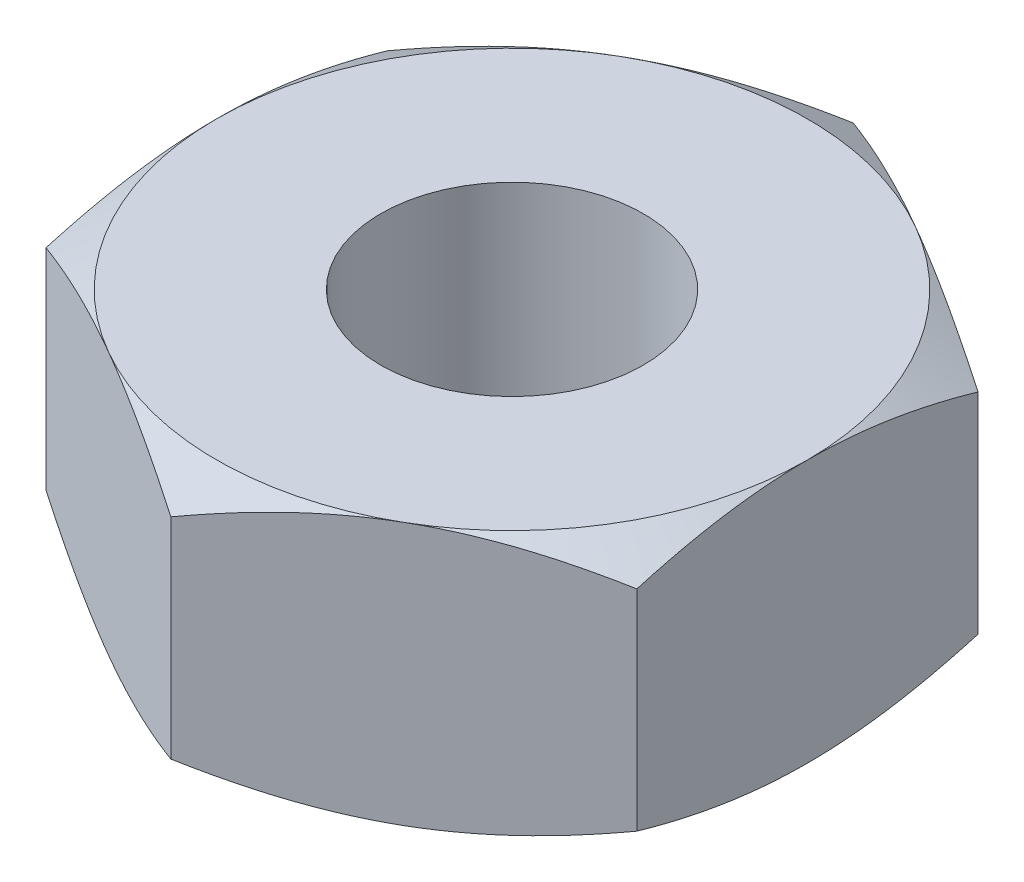
ISO-10303-21;
HEADER;
FILE_DESCRIPTION(('STEP AP214'),'2;1');
FILE_NAME('part.step','',(''),(''),'','','');
FILE_SCHEMA(('AUTOMOTIVE_DESIGN { 1 0 10303 214 1 1 1 1 }'));
ENDSEC;
DATA;
#1=APPLICATION_CONTEXT('core data for automotive mechanical design processes');
#2=APPLICATION_PROTOCOL_DEFINITION('international standard','automotive_design',2000,#1);
#3=PRODUCT_CONTEXT('',#1,'mechanical');
#4=PRODUCT('Part','Part','',(#3));
#5=PRODUCT_RELATED_PRODUCT_CATEGORY('part','',(#4));
#6=PRODUCT_DEFINITION_FORMATION('','',#4);
#7=PRODUCT_DEFINITION_CONTEXT('part definition',#1,'design');
#8=PRODUCT_DEFINITION('design','',#6,#7);
#9=PRODUCT_DEFINITION_SHAPE('','',#8);
#10=(LENGTH_UNIT() NAMED_UNIT(*) SI_UNIT(.MILLI.,.METRE.));
#11=(NAMED_UNIT(*) PLANE_ANGLE_UNIT() SI_UNIT($,.RADIAN.));
#12=(NAMED_UNIT(*) SI_UNIT($,.STERADIAN.) SOLID_ANGLE_UNIT());
#13=UNCERTAINTY_MEASURE_WITH_UNIT(LENGTH_MEASURE(1.E-05),#10,'distance_accuracy_value','');
#14=(GEOMETRIC_REPRESENTATION_CONTEXT(3) GLOBAL_UNCERTAINTY_ASSIGNED_CONTEXT((#13)) GLOBAL_UNIT_ASSIGNED_CONTEXT((#10,
#11,#12)) REPRESENTATION_CONTEXT('',''));
#15=CARTESIAN_POINT('',(0.,0.,0.));
#16=DIRECTION('',(0.,0.,1.));
#17=DIRECTION('',(1.,0.,0.));
#18=AXIS2_PLACEMENT_3D('',#15,#16,#17);
#19=CARTESIAN_POINT('',(-2.24999999999998,2.,1.29903810567668));
#20=DIRECTION('',(0.499999999999995,0.,-0.866025403784441));
#21=DIRECTION('',(-0.866025403784442,0.,-0.499999999999995));
#22=AXIS2_PLACEMENT_3D('',#19,#20,#21);
#23=PLANE('',#22);
#24=CARTESIAN_POINT('',(0.000199999999999888,0.201028565434255,2.59819168140715));
#25=CARTESIAN_POINT('',(-0.098677248814358,0.168055578047864,2.54110487518746));
#26=CARTESIAN_POINT('',(-0.198407997179095,0.138067535415599,2.48352530077259));
#27=CARTESIAN_POINT('',(-0.399596540220634,0.0857223882308793,2.36736904128969));
#28=CARTESIAN_POINT('',(-0.501057910502948,0.0633838027064803,2.30879029184485));
#29=CARTESIAN_POINT('',(-0.702723189801082,0.0286095576734213,2.19235878855587));
#30=CARTESIAN_POINT('',(-0.802896064976676,0.0159424738337213,2.13452395210775));
#31=CARTESIAN_POINT('',(-1.00371331260268,0.000818907417422672,2.01858206013295));
#32=CARTESIAN_POINT('',(-1.10435695483321,-0.00165009697599744,1.96047542619894));
#33=CARTESIAN_POINT('',(-1.29242516452657,0.00347837463603404,1.85189419470647));
#34=CARTESIAN_POINT('',(-1.37987784389126,0.00981663451512526,1.80140336673391));
#35=CARTESIAN_POINT('',(-1.55421343210877,0.0299076571898939,1.7007506679472));
#36=CARTESIAN_POINT('',(-1.64109573768828,0.0436672872310881,1.65058914543305));
#37=CARTESIAN_POINT('',(-1.81579095410173,0.078066265350669,1.54972881521061));
#38=CARTESIAN_POINT('',(-1.90358174743524,0.0988514715826585,1.49904277704713));
#39=CARTESIAN_POINT('',(-2.07785373687758,0.146026087362981,1.39842679703039));
#40=CARTESIAN_POINT('',(-2.16433716675099,0.172404408014303,1.34849556551254));
#41=CARTESIAN_POINT('',(-2.25019999999998,0.201028565434254,1.29892263562285));
#42=B_SPLINE_CURVE_WITH_KNOTS('',3,(#24,#25,#26,#27,#28,#29,#30,#31,#32,#33,#34,#35,#36,#37,#38,
#39,#40,#41),.UNSPECIFIED.,.F.,.F.,(4,2,2,2,2,2,2,2,4),(0.,0.356658826016552,0.714175103224236,
1.06284241804968,1.41108149062516,1.71433394539793,2.01786749258221,2.32813511279243,
2.63779325460357),.UNSPECIFIED.);
#43=CARTESIAN_POINT('',(0.,0.200961894323341,2.59807621135332));
#44=VERTEX_POINT('',#43);
#45=CARTESIAN_POINT('',(-1.12499999999999,0.,1.94855715851499));
#46=VERTEX_POINT('',#45);
#47=EDGE_CURVE('E157',#44,#46,#42,.T.);
#48=ORIENTED_EDGE('',*,*,#47,.F.);
#49=DIRECTION('',(0.,-1.,0.));
#50=VECTOR('',#49,1.);
#51=CARTESIAN_POINT('',(0.,2.,2.59807621135332));
#52=LINE('',#51,#50);
#53=CARTESIAN_POINT('',(0.,1.79903810567666,2.59807621135332));
#54=VERTEX_POINT('',#53);
#55=EDGE_CURVE('E170',#54,#44,#52,.T.);
#56=ORIENTED_EDGE('',*,*,#55,.F.);
#57=CARTESIAN_POINT('',(-2.25019999999998,1.79897143456575,1.29892263562285));
#58=CARTESIAN_POINT('',(-2.15132275118563,1.83194442195214,1.35600944184254));
#59=CARTESIAN_POINT('',(-2.05159200282089,1.8619324645844,1.41358901625741));
#60=CARTESIAN_POINT('',(-1.85040345977935,1.91427761176912,1.52974527574031));
#61=CARTESIAN_POINT('',(-1.74894208949704,1.93661619729352,1.58832402518515));
#62=CARTESIAN_POINT('',(-1.5472768101989,1.97139044232658,1.70475552847413));
#63=CARTESIAN_POINT('',(-1.44710393502331,1.98405752616628,1.76259036492225));
#64=CARTESIAN_POINT('',(-1.2462866873973,1.99918109258258,1.87853225689705));
#65=CARTESIAN_POINT('',(-1.14564304516678,2.001650096976,1.93663889083106));
#66=CARTESIAN_POINT('',(-0.957574835473417,1.99652162536397,2.04522012232353));
#67=CARTESIAN_POINT('',(-0.870122156108725,1.99018336548488,2.09571095029609));
#68=CARTESIAN_POINT('',(-0.695786567891213,1.97009234281011,2.1963636490828));
#69=CARTESIAN_POINT('',(-0.6089042623117,1.95633271276891,2.24652517159695));
#70=CARTESIAN_POINT('',(-0.434209045898256,1.92193373464933,2.34738550181939));
#71=CARTESIAN_POINT('',(-0.34641825256474,1.90114852841734,2.39807153998287));
#72=CARTESIAN_POINT('',(-0.172146263122402,1.85397391263702,2.49868751999961));
#73=CARTESIAN_POINT('',(-0.085662833248996,1.8275955919857,2.54861875151746));
#74=CARTESIAN_POINT('',(0.00020000000000012,1.79897143456575,2.59819168140715));
#75=B_SPLINE_CURVE_WITH_KNOTS('',3,(#57,#58,#59,#60,#61,#62,#63,#64,#65,#66,#67,#68,#69,#70,#71,
#72,#73,#74),.UNSPECIFIED.,.F.,.F.,(4,2,2,2,2,2,2,2,4),(0.,0.356658826016552,0.714175103224236,
1.06284241804968,1.41108149062516,1.71433394539793,2.01786749258221,2.32813511279243,
2.63779325460357),.UNSPECIFIED.);
#76=CARTESIAN_POINT('',(-1.12499999999999,2.,1.948557158515));
#77=VERTEX_POINT('',#76);
#78=EDGE_CURVE('E349',#77,#54,#75,.T.);
#79=ORIENTED_EDGE('',*,*,#78,.F.);
#80=CARTESIAN_POINT('',(-2.24999999999998,1.79903810567666,1.29903810567669));
#81=VERTEX_POINT('',#80);
#82=EDGE_CURVE('E338',#81,#77,#75,.T.);
#83=ORIENTED_EDGE('',*,*,#82,.F.);
#84=DIRECTION('',(0.,-1.,0.));
#85=VECTOR('',#84,1.);
#86=CARTESIAN_POINT('',(-2.24999999999998,2.,1.29903810567668));
#87=LINE('',#86,#85);
#88=CARTESIAN_POINT('',(-2.24999999999998,0.200961894323341,1.29903810567668));
#89=VERTEX_POINT('',#88);
#90=EDGE_CURVE('E265',#81,#89,#87,.T.);
#91=ORIENTED_EDGE('',*,*,#90,.T.);
#92=EDGE_CURVE('E223',#46,#89,#42,.T.);
#93=ORIENTED_EDGE('',*,*,#92,.F.);
#94=EDGE_LOOP('',(#48,#56,#79,#83,#91,#93));
#95=FACE_BOUND('',#94,.T.);
#96=ADVANCED_FACE('F47',(#95),#23,.F.);
#97=CARTESIAN_POINT('',(0.,2.,2.59807621135332));
#98=DIRECTION('',(-0.500000000000001,0.,-0.866025403784438));
#99=DIRECTION('',(-0.866025403784438,0.,0.500000000000001));
#100=AXIS2_PLACEMENT_3D('',#97,#98,#99);
#101=PLANE('',#100);
#102=CARTESIAN_POINT('',(2.2502,0.201028565434254,1.29892263562281));
#103=CARTESIAN_POINT('',(2.15132275118565,0.168055578047864,1.35600944184251));
#104=CARTESIAN_POINT('',(2.05159200282091,0.138067535415598,1.41358901625738));
#105=CARTESIAN_POINT('',(1.85040345977937,0.0857223882308776,1.52974527574028));
#106=CARTESIAN_POINT('',(1.74894208949706,0.0633838027064781,1.58832402518512));
#107=CARTESIAN_POINT('',(1.54727681019892,0.0286095576734181,1.7047555284741));
#108=CARTESIAN_POINT('',(1.44710393502333,0.0159424738337176,1.76259036492223));
#109=CARTESIAN_POINT('',(1.24628668739733,0.000818907417418095,1.87853225689702));
#110=CARTESIAN_POINT('',(1.1456430451668,-0.00165009697600238,1.93663889083104));
#111=CARTESIAN_POINT('',(0.957574835473439,0.00347837463602822,2.04522012232351));
#112=CARTESIAN_POINT('',(0.870122156108745,0.00981663451511919,2.09571095029607));
#113=CARTESIAN_POINT('',(0.695786567891229,0.029907657189888,2.19636364908279));
#114=CARTESIAN_POINT('',(0.608904262311714,0.0436672872310827,2.24652517159694));
#115=CARTESIAN_POINT('',(0.434209045898266,0.0780662653506647,2.34738550181938));
#116=CARTESIAN_POINT('',(0.346418252564748,0.0988514715826548,2.39807153998286));
#117=CARTESIAN_POINT('',(0.172146263122406,0.146026087362979,2.49868751999961));
#118=CARTESIAN_POINT('',(0.0856628332489978,0.172404408014302,2.54861875151746));
#119=CARTESIAN_POINT('',(-0.000200000000000149,0.201028565434255,2.59819168140715));
#120=B_SPLINE_CURVE_WITH_KNOTS('',3,(#102,#103,#104,#105,#106,#107,#108,#109,#110,#111,#112,
#113,#114,#115,#116,#117,#118,#119),.UNSPECIFIED.,.F.,.F.,(4,2,2,2,2,2,2,2,4),(0.,
0.356658826016552,0.714175103224236,1.06284241804968,1.41108149062516,1.71433394539794,
2.01786749258222,2.32813511279246,2.6377932546036),.UNSPECIFIED.);
#121=CARTESIAN_POINT('',(2.25,0.200961894323341,1.29903810567665));
#122=VERTEX_POINT('',#121);
#123=CARTESIAN_POINT('',(1.125,0.,1.94855715851499));
#124=VERTEX_POINT('',#123);
#125=EDGE_CURVE('E137',#122,#124,#120,.T.);
#126=ORIENTED_EDGE('',*,*,#125,.F.);
#127=DIRECTION('',(0.,-1.,0.));
#128=VECTOR('',#127,1.);
#129=CARTESIAN_POINT('',(2.25,2.,1.29903810567665));
#130=LINE('',#129,#128);
#131=CARTESIAN_POINT('',(2.25,1.79903810567666,1.29903810567665));
#132=VERTEX_POINT('',#131);
#133=EDGE_CURVE('E262',#132,#122,#130,.T.);
#134=ORIENTED_EDGE('',*,*,#133,.F.);
#135=CARTESIAN_POINT('',(-0.000200000000000038,1.79897143456575,2.59819168140715));
#136=CARTESIAN_POINT('',(0.0986772488143571,1.83194442195214,2.54110487518745));
#137=CARTESIAN_POINT('',(0.198407997179093,1.8619324645844,2.48352530077259));
#138=CARTESIAN_POINT('',(0.399596540220632,1.91427761176912,2.36736904128969));
#139=CARTESIAN_POINT('',(0.501057910502945,1.93661619729352,2.30879029184485));
#140=CARTESIAN_POINT('',(0.702723189801078,1.97139044232658,2.19235878855587));
#141=CARTESIAN_POINT('',(0.802896064976671,1.98405752616628,2.13452395210774));
#142=CARTESIAN_POINT('',(1.00371331260268,1.99918109258258,2.01858206013295));
#143=CARTESIAN_POINT('',(1.1043569548332,2.001650096976,1.96047542619893));
#144=CARTESIAN_POINT('',(1.29242516452656,1.99652162536397,1.85189419470646));
#145=CARTESIAN_POINT('',(1.37987784389126,1.99018336548488,1.8014033667339));
#146=CARTESIAN_POINT('',(1.55421343210877,1.97009234281011,1.70075066794718));
#147=CARTESIAN_POINT('',(1.64109573768829,1.95633271276892,1.65058914543303));
#148=CARTESIAN_POINT('',(1.81579095410174,1.92193373464934,1.54972881521059));
#149=CARTESIAN_POINT('',(1.90358174743525,1.90114852841735,1.49904277704711));
#150=CARTESIAN_POINT('',(2.0778537368776,1.85397391263702,1.39842679703036));
#151=CARTESIAN_POINT('',(2.16433716675101,1.8275955919857,1.34849556551251));
#152=CARTESIAN_POINT('',(2.2502,1.79897143456575,1.29892263562281));
#153=B_SPLINE_CURVE_WITH_KNOTS('',3,(#135,#136,#137,#138,#139,#140,#141,#142,#143,#144,#145,
#146,#147,#148,#149,#150,#151,#152),.UNSPECIFIED.,.F.,.F.,(4,2,2,2,2,2,2,2,4),(0.,
0.356658826016552,0.714175103224236,1.06284241804968,1.41108149062516,1.71433394539794,
2.01786749258222,2.32813511279246,2.6377932546036),.UNSPECIFIED.);
#154=CARTESIAN_POINT('',(1.125,2.,1.94855715851498));
#155=VERTEX_POINT('',#154);
#156=EDGE_CURVE('E314',#155,#132,#153,.T.);
#157=ORIENTED_EDGE('',*,*,#156,.F.);
#158=EDGE_CURVE('E355',#54,#155,#153,.T.);
#159=ORIENTED_EDGE('',*,*,#158,.F.);
#160=ORIENTED_EDGE('',*,*,#55,.T.);
#161=EDGE_CURVE('E150',#124,#44,#120,.T.);
#162=ORIENTED_EDGE('',*,*,#161,.F.);
#163=EDGE_LOOP('',(#126,#134,#157,#159,#160,#162));
#164=FACE_BOUND('',#163,.T.);
#165=ADVANCED_FACE('F167',(#164),#101,.F.);
#166=CARTESIAN_POINT('',(2.25,2.,1.29903810567665));
#167=DIRECTION('',(-1.,0.,0.));
#168=DIRECTION('',(0.,0.,1.));
#169=AXIS2_PLACEMENT_3D('',#166,#167,#168);
#170=PLANE('',#169);
#171=CARTESIAN_POINT('',(2.24999999999998,1.61654080244334,-4.52098452866439));
#172=CARTESIAN_POINT('',(2.24999999999998,1.5622793592188,-4.41599142010917));
#173=CARTESIAN_POINT('',(2.24999999999998,1.50830287728153,-4.31084978743352));
#174=CARTESIAN_POINT('',(2.24999999999998,1.40106366051152,-4.10020109263546));
#175=CARTESIAN_POINT('',(2.24999999999998,1.34780093790972,-3.99469402428987));
#176=CARTESIAN_POINT('',(2.24999999999999,1.2420515368529,-3.78308278811096));
#177=CARTESIAN_POINT('',(2.24999999999999,1.18956621605644,-3.67697794065522));
#178=CARTESIAN_POINT('',(2.24999999999999,1.08565573015514,-3.46424778031013));
#179=CARTESIAN_POINT('',(2.24999999999999,1.0342305798221,-3.35762246019439));
#180=CARTESIAN_POINT('',(2.24999999999999,0.929974137069099,-3.13800936941929));
#181=CARTESIAN_POINT('',(2.24999999999999,0.877215361007397,-3.02498707842676));
#182=CARTESIAN_POINT('',(2.24999999999999,0.773561201286878,-2.79809197620438));
#183=CARTESIAN_POINT('',(2.24999999999999,0.722665769410088,-2.68421918707491));
#184=CARTESIAN_POINT('',(2.24999999999999,0.623312980238856,-2.45549954074311));
#185=CARTESIAN_POINT('',(2.24999999999999,0.574854022311478,-2.34065338251796));
#186=CARTESIAN_POINT('',(2.24999999999999,0.481072364029688,-2.10965053432444));
#187=CARTESIAN_POINT('',(2.24999999999999,0.435750370947093,-1.9934935556351));
#188=CARTESIAN_POINT('',(2.24999999999999,0.342786865540118,-1.74211109324838));
#189=CARTESIAN_POINT('',(2.24999999999999,0.295814277167549,-1.60663482148119));
#190=CARTESIAN_POINT('',(2.24999999999999,0.209504971922835,-1.33329547913311));
#191=CARTESIAN_POINT('',(2.24999999999999,0.170164497661106,-1.19543361960659));
#192=CARTESIAN_POINT('',(2.25,0.102545421444102,-0.919807712995503));
#193=CARTESIAN_POINT('',(2.25,0.0740661287099888,-0.782094149233218));
#194=CARTESIAN_POINT('',(2.25,0.0300512713647038,-0.504588051380646));
#195=CARTESIAN_POINT('',(2.25,0.014507998879176,-0.364796805887873));
#196=CARTESIAN_POINT('',(2.25,0.0023704225374084,-0.153462339780318));
#197=CARTESIAN_POINT('',(2.25,0.000213996781182373,-0.0822117789549886));
#198=CARTESIAN_POINT('',(2.25,-0.000183212053853473,0.0603054030350355));
#199=CARTESIAN_POINT('',(2.25,0.00157599640119382,0.131572024164672));
#200=CARTESIAN_POINT('',(2.25,0.0089502057021648,0.273914915401403));
#201=CARTESIAN_POINT('',(2.25,0.0145658718900115,0.344991150537259));
#202=CARTESIAN_POINT('',(2.25,0.0294416789960548,0.486765918608929));
#203=CARTESIAN_POINT('',(2.25,0.0387024235819208,0.557464387015431));
#204=CARTESIAN_POINT('',(2.25,0.0719467245433681,0.771646015798226));
#205=CARTESIAN_POINT('',(2.25,0.101223215970862,0.914319075380863));
#206=CARTESIAN_POINT('',(2.25,0.170517946349334,1.19697326353252));
#207=CARTESIAN_POINT('',(2.25,0.210540113399166,1.33695338760175));
#208=CARTESIAN_POINT('',(2.25,0.297739554545349,1.61234208513246));
#209=CARTESIAN_POINT('',(2.25,0.344801894937849,1.74778767009233));
#210=CARTESIAN_POINT('',(2.25,0.444406417047664,2.01666306398133));
#211=CARTESIAN_POINT('',(2.25000000000001,0.496950100596508,2.15009230892905));
#212=CARTESIAN_POINT('',(2.25000000000001,0.60606488135797,2.41545563737937));
#213=CARTESIAN_POINT('',(2.25000000000001,0.662640440948189,2.54738787085509));
#214=CARTESIAN_POINT('',(2.25000000000001,0.778720831616846,2.80995900607909));
#215=CARTESIAN_POINT('',(2.25000000000001,0.838225833570134,2.94059783184758));
#216=CARTESIAN_POINT('',(2.25000000000001,0.955861758041667,3.19318812855258));
#217=CARTESIAN_POINT('',(2.25000000000001,1.01386731062023,3.31519822826409));
#218=CARTESIAN_POINT('',(2.25000000000001,1.13138940640332,3.55849232400212));
#219=CARTESIAN_POINT('',(2.25000000000001,1.19090600389569,3.67977629374671));
#220=CARTESIAN_POINT('',(2.25000000000001,1.31091123446663,3.92132491393736));
#221=CARTESIAN_POINT('',(2.25000000000001,1.37139567148893,4.04159165394789));
#222=CARTESIAN_POINT('',(2.25000000000001,1.49331218297334,4.28163063441634));
#223=CARTESIAN_POINT('',(2.25000000000001,1.5547441718645,4.40140291830326));
#224=CARTESIAN_POINT('',(2.25000000000001,1.61654080244334,4.52098452866437));
#225=B_SPLINE_CURVE_WITH_KNOTS('',3,(#171,#172,#173,#174,#175,#176,#177,#178,#179,#180,#181,
#182,#183,#184,#185,#186,#187,#188,#189,#190,#191,#192,#193,#194,#195,#196,#197,#198,#199,#200,
#201,#202,#203,#204,#205,#206,#207,#208,#209,#210,#211,#212,#213,#214,#215,#216,#217,#218,#219,
#220,#221,#222,#223,#224),.UNSPECIFIED.,.F.,.F.,(4,2,2,2,2,2,2,2,2,2,2,2,2,2,2,2,2,2,2,2,2,2,2,
2,2,2,4),(0.,0.354558289452688,0.709122646842153,1.06424666910254,1.4193756361108,
1.79355189161133,2.16771845765633,2.54163591555204,2.91563740549302,3.34564307397043,
3.77543650480266,4.19685151312075,4.61801524290633,4.83177056313858,5.04552542120271,
5.25931716695488,5.47314433403135,5.90946317070492,6.34594172209234,6.77594617504564,
7.20606875577626,7.63667500851676,8.0673064084192,8.47258371771619,8.87787560822176,
9.28173008673866,9.68554830529468),.UNSPECIFIED.);
#226=CARTESIAN_POINT('',(2.24999999999999,0.200961894323341,-1.29903810567667));
#227=VERTEX_POINT('',#226);
#228=CARTESIAN_POINT('',(2.25,0.,0.));
#229=VERTEX_POINT('',#228);
#230=EDGE_CURVE('E64',#227,#229,#225,.T.);
#231=ORIENTED_EDGE('',*,*,#230,.F.);
#232=DIRECTION('',(0.,-1.,0.));
#233=VECTOR('',#232,1.);
#234=CARTESIAN_POINT('',(2.24999999999999,2.,-1.29903810567667));
#235=LINE('',#234,#233);
#236=CARTESIAN_POINT('',(2.24999999999999,1.79903810567666,-1.29903810567667));
#237=VERTEX_POINT('',#236);
#238=EDGE_CURVE('E257',#237,#227,#235,.T.);
#239=ORIENTED_EDGE('',*,*,#238,.F.);
#240=CARTESIAN_POINT('',(2.25000000000001,0.383459197556663,4.52098452866437));
#241=CARTESIAN_POINT('',(2.25000000000001,0.4377206407812,4.41599142010916));
#242=CARTESIAN_POINT('',(2.25000000000001,0.491697122718474,4.3108497874335));
#243=CARTESIAN_POINT('',(2.25000000000001,0.598936339488481,4.10020109263545));
#244=CARTESIAN_POINT('',(2.25000000000001,0.652199062090284,3.99469402428986));
#245=CARTESIAN_POINT('',(2.25000000000001,0.757948463147096,3.78308278811094));
#246=CARTESIAN_POINT('',(2.25000000000001,0.810433783943561,3.67697794065521));
#247=CARTESIAN_POINT('',(2.25000000000001,0.914344269844857,3.46424778031012));
#248=CARTESIAN_POINT('',(2.25000000000001,0.965769420177902,3.35762246019437));
#249=CARTESIAN_POINT('',(2.25000000000001,1.0700258629309,3.13800936941928));
#250=CARTESIAN_POINT('',(2.25000000000001,1.1227846389926,3.02498707842674));
#251=CARTESIAN_POINT('',(2.25000000000001,1.22643879871312,2.79809197620436));
#252=CARTESIAN_POINT('',(2.25000000000001,1.27733423058991,2.6842191870749));
#253=CARTESIAN_POINT('',(2.25000000000001,1.37668701976114,2.45549954074309));
#254=CARTESIAN_POINT('',(2.25000000000001,1.42514597768852,2.34065338251794));
#255=CARTESIAN_POINT('',(2.25000000000001,1.51892763597031,2.10965053432442));
#256=CARTESIAN_POINT('',(2.25,1.56424962905291,1.99349355563509));
#257=CARTESIAN_POINT('',(2.25,1.65721313445988,1.74211109324836));
#258=CARTESIAN_POINT('',(2.25,1.70418572283245,1.60663482148117));
#259=CARTESIAN_POINT('',(2.25,1.79049502807717,1.3332954791331));
#260=CARTESIAN_POINT('',(2.25,1.82983550233889,1.19543361960658));
#261=CARTESIAN_POINT('',(2.25,1.8974545785559,0.919807712995487));
#262=CARTESIAN_POINT('',(2.25,1.92593387129001,0.782094149233201));
#263=CARTESIAN_POINT('',(2.25,1.9699487286353,0.50458805138063));
#264=CARTESIAN_POINT('',(2.25,1.98549200112082,0.364796805887857));
#265=CARTESIAN_POINT('',(2.25,1.99762957746259,0.153462339780302));
#266=CARTESIAN_POINT('',(2.25,1.99978600321882,0.0822117789549724));
#267=CARTESIAN_POINT('',(2.25,2.00018321205385,-0.0603054030350518));
#268=CARTESIAN_POINT('',(2.25,1.99842400359881,-0.131572024164689));
#269=CARTESIAN_POINT('',(2.25,1.99104979429784,-0.273914915401419));
#270=CARTESIAN_POINT('',(2.25,1.98543412810999,-0.344991150537275));
#271=CARTESIAN_POINT('',(2.25,1.97055832100395,-0.486765918608945));
#272=CARTESIAN_POINT('',(2.25,1.96129757641808,-0.557464387015447));
#273=CARTESIAN_POINT('',(2.25,1.92805327545663,-0.771646015798242));
#274=CARTESIAN_POINT('',(2.25,1.89877678402914,-0.914319075380879));
#275=CARTESIAN_POINT('',(2.24999999999999,1.82948205365067,-1.19697326353254));
#276=CARTESIAN_POINT('',(2.24999999999999,1.78945988660083,-1.33695338760177));
#277=CARTESIAN_POINT('',(2.24999999999999,1.70226044545465,-1.61234208513248));
#278=CARTESIAN_POINT('',(2.24999999999999,1.65519810506215,-1.74778767009235));
#279=CARTESIAN_POINT('',(2.24999999999999,1.55559358295234,-2.01666306398134));
#280=CARTESIAN_POINT('',(2.24999999999999,1.50304989940349,-2.15009230892906));
#281=CARTESIAN_POINT('',(2.24999999999999,1.39393511864203,-2.41545563737939));
#282=CARTESIAN_POINT('',(2.24999999999999,1.33735955905181,-2.54738787085511));
#283=CARTESIAN_POINT('',(2.24999999999999,1.22127916838315,-2.80995900607911));
#284=CARTESIAN_POINT('',(2.24999999999999,1.16177416642987,-2.94059783184759));
#285=CARTESIAN_POINT('',(2.24999999999999,1.04413824195833,-3.1931881285526));
#286=CARTESIAN_POINT('',(2.24999999999999,0.986132689379765,-3.3151982282641));
#287=CARTESIAN_POINT('',(2.24999999999999,0.868610593596684,-3.55849232400214));
#288=CARTESIAN_POINT('',(2.24999999999999,0.809093996104306,-3.67977629374673));
#289=CARTESIAN_POINT('',(2.24999999999999,0.689088765533371,-3.92132491393737));
#290=CARTESIAN_POINT('',(2.24999999999998,0.628604328511068,-4.0415916539479));
#291=CARTESIAN_POINT('',(2.24999999999998,0.506687817026658,-4.28163063441635));
#292=CARTESIAN_POINT('',(2.24999999999998,0.445255828135495,-4.40140291830328));
#293=CARTESIAN_POINT('',(2.24999999999998,0.383459197556663,-4.52098452866439));
#294=B_SPLINE_CURVE_WITH_KNOTS('',3,(#240,#241,#242,#243,#244,#245,#246,#247,#248,#249,#250,
#251,#252,#253,#254,#255,#256,#257,#258,#259,#260,#261,#262,#263,#264,#265,#266,#267,#268,#269,
#270,#271,#272,#273,#274,#275,#276,#277,#278,#279,#280,#281,#282,#283,#284,#285,#286,#287,#288,
#289,#290,#291,#292,#293),.UNSPECIFIED.,.F.,.F.,(4,2,2,2,2,2,2,2,2,2,2,2,2,2,2,2,2,2,2,2,2,2,2,
2,2,2,4),(0.,0.35455828945269,0.709122646842154,1.06424666910255,1.4193756361108,
1.79355189161134,2.16771845765633,2.54163591555204,2.91563740549302,3.34564307397043,
3.77543650480266,4.19685151312075,4.61801524290633,4.83177056313858,5.04552542120271,
5.25931716695488,5.47314433403135,5.90946317070492,6.34594172209234,6.77594617504564,
7.20606875577626,7.63667500851676,8.0673064084192,8.47258371771619,8.87787560822177,
9.28173008673866,9.68554830529468),.UNSPECIFIED.);
#295=CARTESIAN_POINT('',(2.25,2.,0.));
#296=VERTEX_POINT('',#295);
#297=EDGE_CURVE('E306',#296,#237,#294,.T.);
#298=ORIENTED_EDGE('',*,*,#297,.F.);
#299=EDGE_CURVE('E313',#132,#296,#294,.T.);
#300=ORIENTED_EDGE('',*,*,#299,.F.);
#301=ORIENTED_EDGE('',*,*,#133,.T.);
#302=EDGE_CURVE('E143',#229,#122,#225,.T.);
#303=ORIENTED_EDGE('',*,*,#302,.F.);
#304=EDGE_LOOP('',(#231,#239,#298,#300,#301,#303));
#305=FACE_BOUND('',#304,.T.);
#306=ADVANCED_FACE('F320',(#305),#170,.F.);
#307=CARTESIAN_POINT('',(2.24999999999999,2.,-1.29903810567667));
#308=DIRECTION('',(-0.499999999999995,0.,0.866025403784441));
#309=DIRECTION('',(0.866025403784442,0.,0.499999999999995));
#310=AXIS2_PLACEMENT_3D('',#307,#308,#309);
#311=PLANE('',#310);
#312=CARTESIAN_POINT('',(-0.000200000000018038,0.201028565434255,-2.59819168140715));
#313=CARTESIAN_POINT('',(0.0986772488143396,0.168055578047864,-2.54110487518746));
#314=CARTESIAN_POINT('',(0.198407997179076,0.138067535415598,-2.48352530077259));
#315=CARTESIAN_POINT('',(0.399596540220616,0.0857223882308776,-2.36736904128969));
#316=CARTESIAN_POINT('',(0.501057910502929,0.0633838027064782,-2.30879029184485));
#317=CARTESIAN_POINT('',(0.702723189801063,0.0286095576734182,-2.19235878855587));
#318=CARTESIAN_POINT('',(0.802896064976656,0.0159424738337176,-2.13452395210775));
#319=CARTESIAN_POINT('',(1.00371331260266,0.000818907417418002,-2.01858206013295));
#320=CARTESIAN_POINT('',(1.10435695483319,-0.00165009697600242,-1.96047542619894));
#321=CARTESIAN_POINT('',(1.29242516452655,0.00347837463602814,-1.85189419470646));
#322=CARTESIAN_POINT('',(1.37987784389124,0.00981663451511904,-1.80140336673391));
#323=CARTESIAN_POINT('',(1.55421343210876,0.0299076571898878,-1.70075066794719));
#324=CARTESIAN_POINT('',(1.64109573768828,0.0436672872310826,-1.65058914543304));
#325=CARTESIAN_POINT('',(1.81579095410173,0.0780662653506647,-1.5497288152106));
#326=CARTESIAN_POINT('',(1.90358174743524,0.0988514715826548,-1.49904277704712));
#327=CARTESIAN_POINT('',(2.07785373687759,0.146026087362979,-1.39842679703038));
#328=CARTESIAN_POINT('',(2.164337166751,0.172404408014302,-1.34849556551252));
#329=CARTESIAN_POINT('',(2.25019999999999,0.201028565434255,-1.29892263562283));
#330=B_SPLINE_CURVE_WITH_KNOTS('',3,(#312,#313,#314,#315,#316,#317,#318,#319,#320,#321,#322,
#323,#324,#325,#326,#327,#328,#329),.UNSPECIFIED.,.F.,.F.,(4,2,2,2,2,2,2,2,4),(0.,
0.356658826016552,0.714175103224236,1.06284241804968,1.41108149062516,1.71433394539794,
2.01786749258222,2.32813511279246,2.6377932546036),.UNSPECIFIED.);
#331=CARTESIAN_POINT('',(0.,0.200961894323341,-2.59807621135332));
#332=VERTEX_POINT('',#331);
#333=CARTESIAN_POINT('',(1.12499999999999,0.,-1.94855715851499));
#334=VERTEX_POINT('',#333);
#335=EDGE_CURVE('E71',#332,#334,#330,.T.);
#336=ORIENTED_EDGE('',*,*,#335,.F.);
#337=DIRECTION('',(0.,-1.,0.));
#338=VECTOR('',#337,1.);
#339=CARTESIAN_POINT('',(0.,2.,-2.59807621135332));
#340=LINE('',#339,#338);
#341=CARTESIAN_POINT('',(0.,1.79903810567666,-2.59807621135332));
#342=VERTEX_POINT('',#341);
#343=EDGE_CURVE('E249',#342,#332,#340,.T.);
#344=ORIENTED_EDGE('',*,*,#343,.F.);
#345=CARTESIAN_POINT('',(2.25019999999999,1.79897143456575,-1.29892263562283));
#346=CARTESIAN_POINT('',(2.15132275118564,1.83194442195214,-1.35600944184253));
#347=CARTESIAN_POINT('',(2.0515920028209,1.8619324645844,-1.41358901625739));
#348=CARTESIAN_POINT('',(1.85040345977936,1.91427761176912,-1.52974527574029));
#349=CARTESIAN_POINT('',(1.74894208949705,1.93661619729352,-1.58832402518513));
#350=CARTESIAN_POINT('',(1.54727681019891,1.97139044232658,-1.70475552847411));
#351=CARTESIAN_POINT('',(1.44710393502332,1.98405752616628,-1.76259036492224));
#352=CARTESIAN_POINT('',(1.24628668739731,1.99918109258258,-1.87853225689703));
#353=CARTESIAN_POINT('',(1.14564304516679,2.001650096976,-1.93663889083105));
#354=CARTESIAN_POINT('',(0.957574835473425,1.99652162536397,-2.04522012232352));
#355=CARTESIAN_POINT('',(0.870122156108731,1.99018336548488,-2.09571095029608));
#356=CARTESIAN_POINT('',(0.695786567891214,1.97009234281011,-2.19636364908279));
#357=CARTESIAN_POINT('',(0.608904262311699,1.95633271276892,-2.24652517159694));
#358=CARTESIAN_POINT('',(0.43420904589825,1.92193373464934,-2.34738550181938));
#359=CARTESIAN_POINT('',(0.346418252564731,1.90114852841735,-2.39807153998286));
#360=CARTESIAN_POINT('',(0.172146263122388,1.85397391263702,-2.49868751999961));
#361=CARTESIAN_POINT('',(0.0856628332489803,1.8275955919857,-2.54861875151746));
#362=CARTESIAN_POINT('',(-0.000200000000018126,1.79897143456575,-2.59819168140715));
#363=B_SPLINE_CURVE_WITH_KNOTS('',3,(#345,#346,#347,#348,#349,#350,#351,#352,#353,#354,#355,
#356,#357,#358,#359,#360,#361,#362),.UNSPECIFIED.,.F.,.F.,(4,2,2,2,2,2,2,2,4),(0.,
0.356658826016552,0.714175103224236,1.06284241804968,1.41108149062516,1.71433394539794,
2.01786749258222,2.32813511279246,2.6377932546036),.UNSPECIFIED.);
#364=CARTESIAN_POINT('',(1.12499999999999,2.,-1.94855715851499));
#365=VERTEX_POINT('',#364);
#366=EDGE_CURVE('E298',#365,#342,#363,.T.);
#367=ORIENTED_EDGE('',*,*,#366,.F.);
#368=EDGE_CURVE('E305',#237,#365,#363,.T.);
#369=ORIENTED_EDGE('',*,*,#368,.F.);
#370=ORIENTED_EDGE('',*,*,#238,.T.);
#371=EDGE_CURVE('E149',#334,#227,#330,.T.);
#372=ORIENTED_EDGE('',*,*,#371,.F.);
#373=EDGE_LOOP('',(#336,#344,#367,#369,#370,#372));
#374=FACE_BOUND('',#373,.T.);
#375=ADVANCED_FACE('F247',(#374),#311,.F.);
#376=CARTESIAN_POINT('',(0.,2.,-2.59807621135332));
#377=DIRECTION('',(0.500000000000007,0.,0.866025403784434));
#378=DIRECTION('',(0.866025403784434,0.,-0.500000000000007));
#379=AXIS2_PLACEMENT_3D('',#376,#377,#378);
#380=PLANE('',#379);
#381=CARTESIAN_POINT('',(-2.25020000000001,0.201028565434254,-1.2989226356228));
#382=CARTESIAN_POINT('',(-2.15132275118565,0.168055578047864,-1.3560094418425));
#383=CARTESIAN_POINT('',(-2.05159200282092,0.138067535415598,-1.41358901625736));
#384=CARTESIAN_POINT('',(-1.85040345977938,0.0857223882308775,-1.52974527574027));
#385=CARTESIAN_POINT('',(-1.74894208949707,0.063383802706478,-1.58832402518511));
#386=CARTESIAN_POINT('',(-1.54727681019894,0.0286095576734181,-1.70475552847409));
#387=CARTESIAN_POINT('',(-1.44710393502334,0.0159424738337177,-1.76259036492222));
#388=CARTESIAN_POINT('',(-1.24628668739734,0.000818907417418068,-1.87853225689701));
#389=CARTESIAN_POINT('',(-1.14564304516682,-0.00165009697600252,-1.93663889083103));
#390=CARTESIAN_POINT('',(-0.957574835473453,0.0034783746360281,-2.04522012232351));
#391=CARTESIAN_POINT('',(-0.87012215610876,0.00981663451511917,-2.09571095029607));
#392=CARTESIAN_POINT('',(-0.695786567891244,0.029907657189888,-2.19636364908278));
#393=CARTESIAN_POINT('',(-0.60890426231173,0.0436672872310825,-2.24652517159693));
#394=CARTESIAN_POINT('',(-0.434209045898282,0.0780662653506645,-2.34738550181938));
#395=CARTESIAN_POINT('',(-0.346418252564765,0.0988514715826547,-2.39807153998286));
#396=CARTESIAN_POINT('',(-0.172146263122423,0.146026087362979,-2.49868751999961));
#397=CARTESIAN_POINT('',(-0.0856628332490158,0.172404408014302,-2.54861875151746));
#398=CARTESIAN_POINT('',(0.000199999999981981,0.201028565434255,-2.59819168140715));
#399=B_SPLINE_CURVE_WITH_KNOTS('',3,(#381,#382,#383,#384,#385,#386,#387,#388,#389,#390,#391,
#392,#393,#394,#395,#396,#397,#398),.UNSPECIFIED.,.F.,.F.,(4,2,2,2,2,2,2,2,4),(0.,
0.356658826016552,0.714175103224236,1.06284241804968,1.41108149062516,1.71433394539794,
2.01786749258222,2.32813511279246,2.6377932546036),.UNSPECIFIED.);
#400=CARTESIAN_POINT('',(-2.25000000000001,0.200961894323338,-1.29903810567664));
#401=VERTEX_POINT('',#400);
#402=CARTESIAN_POINT('',(-1.12500000000002,0.,-1.94855715851498));
#403=VERTEX_POINT('',#402);
#404=EDGE_CURVE('E217',#401,#403,#399,.T.);
#405=ORIENTED_EDGE('',*,*,#404,.F.);
#406=DIRECTION('',(0.,-1.,0.));
#407=VECTOR('',#406,1.);
#408=CARTESIAN_POINT('',(-2.25000000000001,2.,-1.29903810567664));
#409=LINE('',#408,#407);
#410=CARTESIAN_POINT('',(-2.25000000000001,1.79903810567666,-1.29903810567664));
#411=VERTEX_POINT('',#410);
#412=EDGE_CURVE('E258',#411,#401,#409,.T.);
#413=ORIENTED_EDGE('',*,*,#412,.F.);
#414=CARTESIAN_POINT('',(0.000199999999981895,1.79897143456575,-2.59819168140715));
#415=CARTESIAN_POINT('',(-0.0986772488143751,1.83194442195214,-2.54110487518745));
#416=CARTESIAN_POINT('',(-0.198407997179111,1.8619324645844,-2.48352530077259));
#417=CARTESIAN_POINT('',(-0.399596540220649,1.91427761176912,-2.36736904128969));
#418=CARTESIAN_POINT('',(-0.501057910502961,1.93661619729352,-2.30879029184484));
#419=CARTESIAN_POINT('',(-0.702723189801093,1.97139044232658,-2.19235878855586));
#420=CARTESIAN_POINT('',(-0.802896064976686,1.98405752616628,-2.13452395210774));
#421=CARTESIAN_POINT('',(-1.00371331260269,1.99918109258258,-2.01858206013294));
#422=CARTESIAN_POINT('',(-1.10435695483321,2.001650096976,-1.96047542619892));
#423=CARTESIAN_POINT('',(-1.29242516452658,1.99652162536397,-1.85189419470645));
#424=CARTESIAN_POINT('',(-1.37987784389127,1.99018336548488,-1.80140336673389));
#425=CARTESIAN_POINT('',(-1.55421343210879,1.97009234281011,-1.70075066794717));
#426=CARTESIAN_POINT('',(-1.6410957376883,1.95633271276892,-1.65058914543302));
#427=CARTESIAN_POINT('',(-1.81579095410175,1.92193373464934,-1.54972881521057));
#428=CARTESIAN_POINT('',(-1.90358174743527,1.90114852841735,-1.4990427770471));
#429=CARTESIAN_POINT('',(-2.07785373687761,1.85397391263702,-1.39842679703035));
#430=CARTESIAN_POINT('',(-2.16433716675101,1.8275955919857,-1.34849556551249));
#431=CARTESIAN_POINT('',(-2.25020000000001,1.79897143456575,-1.2989226356228));
#432=B_SPLINE_CURVE_WITH_KNOTS('',3,(#414,#415,#416,#417,#418,#419,#420,#421,#422,#423,#424,
#425,#426,#427,#428,#429,#430,#431),.UNSPECIFIED.,.F.,.F.,(4,2,2,2,2,2,2,2,4),(0.,
0.356658826016552,0.714175103224236,1.06284241804968,1.41108149062516,1.71433394539794,
2.01786749258222,2.32813511279246,2.6377932546036),.UNSPECIFIED.);
#433=CARTESIAN_POINT('',(-1.12500000000002,2.,-1.94855715851498));
#434=VERTEX_POINT('',#433);
#435=EDGE_CURVE('E290',#434,#411,#432,.T.);
#436=ORIENTED_EDGE('',*,*,#435,.F.);
#437=EDGE_CURVE('E255',#342,#434,#432,.T.);
#438=ORIENTED_EDGE('',*,*,#437,.F.);
#439=ORIENTED_EDGE('',*,*,#343,.T.);
#440=EDGE_CURVE('E173',#403,#332,#399,.T.);
#441=ORIENTED_EDGE('',*,*,#440,.F.);
#442=EDGE_LOOP('',(#405,#413,#436,#438,#439,#441));
#443=FACE_BOUND('',#442,.T.);
#444=ADVANCED_FACE('F252',(#443),#380,.F.);
#445=CARTESIAN_POINT('',(-2.25000000000001,2.,-1.29903810567664));
#446=DIRECTION('',(1.,0.,0.));
#447=DIRECTION('',(0.,0.,-1.));
#448=AXIS2_PLACEMENT_3D('',#445,#446,#447);
#449=PLANE('',#448);
#450=CARTESIAN_POINT('',(-2.24999999999995,1.61654080244334,4.52098452866441));
#451=CARTESIAN_POINT('',(-2.24999999999995,1.5622793592188,4.41599142010919));
#452=CARTESIAN_POINT('',(-2.24999999999995,1.50830287728153,4.31084978743354));
#453=CARTESIAN_POINT('',(-2.24999999999996,1.40106366051152,4.10020109263548));
#454=CARTESIAN_POINT('',(-2.24999999999996,1.34780093790972,3.99469402428989));
#455=CARTESIAN_POINT('',(-2.24999999999996,1.2420515368529,3.78308278811097));
#456=CARTESIAN_POINT('',(-2.24999999999996,1.18956621605644,3.67697794065524));
#457=CARTESIAN_POINT('',(-2.24999999999996,1.08565573015514,3.46424778031015));
#458=CARTESIAN_POINT('',(-2.24999999999996,1.0342305798221,3.35762246019441));
#459=CARTESIAN_POINT('',(-2.24999999999997,0.929974137069099,3.13800936941931));
#460=CARTESIAN_POINT('',(-2.24999999999997,0.877215361007397,3.02498707842677));
#461=CARTESIAN_POINT('',(-2.24999999999997,0.773561201286877,2.79809197620439));
#462=CARTESIAN_POINT('',(-2.24999999999997,0.722665769410088,2.68421918707493));
#463=CARTESIAN_POINT('',(-2.24999999999997,0.623312980238856,2.45549954074312));
#464=CARTESIAN_POINT('',(-2.24999999999997,0.574854022311478,2.34065338251798));
#465=CARTESIAN_POINT('',(-2.24999999999998,0.481072364029688,2.10965053432446));
#466=CARTESIAN_POINT('',(-2.24999999999998,0.435750370947093,1.99349355563512));
#467=CARTESIAN_POINT('',(-2.24999999999998,0.342786865540118,1.74211109324839));
#468=CARTESIAN_POINT('',(-2.24999999999998,0.295814277167549,1.6066348214812));
#469=CARTESIAN_POINT('',(-2.24999999999998,0.209504971922835,1.33329547913313));
#470=CARTESIAN_POINT('',(-2.24999999999999,0.170164497661106,1.19543361960661));
#471=CARTESIAN_POINT('',(-2.24999999999999,0.102545421444102,0.919807712995519));
#472=CARTESIAN_POINT('',(-2.24999999999999,0.0740661287099885,0.782094149233234));
#473=CARTESIAN_POINT('',(-2.24999999999999,0.0300512713647035,0.504588051380663));
#474=CARTESIAN_POINT('',(-2.24999999999999,0.0145079988791759,0.364796805887889));
#475=CARTESIAN_POINT('',(-2.25,0.00237042253740835,0.153462339780334));
#476=CARTESIAN_POINT('',(-2.25,0.000213996781182284,0.0822117789550048));
#477=CARTESIAN_POINT('',(-2.25,-0.000183212053853725,-0.0603054030350195));
#478=CARTESIAN_POINT('',(-2.25,0.00157599640119344,-0.131572024164656));
#479=CARTESIAN_POINT('',(-2.25,0.0089502057021646,-0.273914915401387));
#480=CARTESIAN_POINT('',(-2.25,0.0145658718900115,-0.344991150537243));
#481=CARTESIAN_POINT('',(-2.25,0.0294416789960549,-0.486765918608913));
#482=CARTESIAN_POINT('',(-2.25,0.0387024235819206,-0.557464387015415));
#483=CARTESIAN_POINT('',(-2.25000000000001,0.0719467245433676,-0.771646015798209));
#484=CARTESIAN_POINT('',(-2.25000000000001,0.101223215970862,-0.914319075380846));
#485=CARTESIAN_POINT('',(-2.25000000000001,0.170517946349335,-1.1969732635325));
#486=CARTESIAN_POINT('',(-2.25000000000001,0.210540113399166,-1.33695338760174));
#487=CARTESIAN_POINT('',(-2.25000000000002,0.297739554545349,-1.61234208513245));
#488=CARTESIAN_POINT('',(-2.25000000000002,0.344801894937849,-1.74778767009231));
#489=CARTESIAN_POINT('',(-2.25000000000002,0.444406417047664,-2.01666306398131));
#490=CARTESIAN_POINT('',(-2.25000000000002,0.496950100596508,-2.15009230892903));
#491=CARTESIAN_POINT('',(-2.25000000000002,0.60606488135797,-2.41545563737935));
#492=CARTESIAN_POINT('',(-2.25000000000002,0.662640440948189,-2.54738787085507));
#493=CARTESIAN_POINT('',(-2.25000000000003,0.778720831616846,-2.80995900607907));
#494=CARTESIAN_POINT('',(-2.25000000000003,0.838225833570133,-2.94059783184756));
#495=CARTESIAN_POINT('',(-2.25000000000003,0.955861758041667,-3.19318812855256));
#496=CARTESIAN_POINT('',(-2.25000000000003,1.01386731062023,-3.31519822826407));
#497=CARTESIAN_POINT('',(-2.25000000000004,1.13138940640331,-3.55849232400211));
#498=CARTESIAN_POINT('',(-2.25000000000004,1.19090600389569,-3.67977629374669));
#499=CARTESIAN_POINT('',(-2.25000000000004,1.31091123446663,-3.92132491393734));
#500=CARTESIAN_POINT('',(-2.25000000000004,1.37139567148893,-4.04159165394787));
#501=CARTESIAN_POINT('',(-2.25000000000004,1.49331218297334,-4.28163063441632));
#502=CARTESIAN_POINT('',(-2.25000000000004,1.5547441718645,-4.40140291830324));
#503=CARTESIAN_POINT('',(-2.25000000000005,1.61654080244334,-4.52098452866436));
#504=B_SPLINE_CURVE_WITH_KNOTS('',3,(#450,#451,#452,#453,#454,#455,#456,#457,#458,#459,#460,
#461,#462,#463,#464,#465,#466,#467,#468,#469,#470,#471,#472,#473,#474,#475,#476,#477,#478,#479,
#480,#481,#482,#483,#484,#485,#486,#487,#488,#489,#490,#491,#492,#493,#494,#495,#496,#497,#498,
#499,#500,#501,#502,#503),.UNSPECIFIED.,.F.,.F.,(4,2,2,2,2,2,2,2,2,2,2,2,2,2,2,2,2,2,2,2,2,2,2,
2,2,2,4),(0.,0.354558289452689,0.709122646842153,1.06424666910254,1.4193756361108,
1.79355189161133,2.16771845765633,2.54163591555204,2.91563740549302,3.34564307397043,
3.77543650480266,4.19685151312075,4.61801524290633,4.83177056313858,5.0455254212027,
5.25931716695488,5.47314433403134,5.90946317070491,6.34594172209234,6.77594617504564,
7.20606875577625,7.63667500851676,8.0673064084192,8.47258371771618,8.87787560822176,
9.28173008673866,9.68554830529468),.UNSPECIFIED.);
#505=CARTESIAN_POINT('',(-2.25,0.,0.));
#506=VERTEX_POINT('',#505);
#507=EDGE_CURVE('E234',#89,#506,#504,.T.);
#508=ORIENTED_EDGE('',*,*,#507,.F.);
#509=ORIENTED_EDGE('',*,*,#90,.F.);
#510=CARTESIAN_POINT('',(-2.25000000000005,0.383459197556663,-4.52098452866436));
#511=CARTESIAN_POINT('',(-2.25000000000004,0.4377206407812,-4.41599142010914));
#512=CARTESIAN_POINT('',(-2.25000000000004,0.491697122718474,-4.31084978743349));
#513=CARTESIAN_POINT('',(-2.25000000000004,0.598936339488481,-4.10020109263543));
#514=CARTESIAN_POINT('',(-2.25000000000004,0.652199062090284,-3.99469402428984));
#515=CARTESIAN_POINT('',(-2.25000000000004,0.757948463147096,-3.78308278811093));
#516=CARTESIAN_POINT('',(-2.25000000000004,0.810433783943561,-3.67697794065519));
#517=CARTESIAN_POINT('',(-2.25000000000003,0.914344269844857,-3.4642477803101));
#518=CARTESIAN_POINT('',(-2.25000000000003,0.965769420177902,-3.35762246019436));
#519=CARTESIAN_POINT('',(-2.25000000000003,1.0700258629309,-3.13800936941926));
#520=CARTESIAN_POINT('',(-2.25000000000003,1.1227846389926,-3.02498707842673));
#521=CARTESIAN_POINT('',(-2.25000000000003,1.22643879871312,-2.79809197620435));
#522=CARTESIAN_POINT('',(-2.25000000000003,1.27733423058991,-2.68421918707488));
#523=CARTESIAN_POINT('',(-2.25000000000002,1.37668701976114,-2.45549954074307));
#524=CARTESIAN_POINT('',(-2.25000000000002,1.42514597768852,-2.34065338251793));
#525=CARTESIAN_POINT('',(-2.25000000000002,1.51892763597031,-2.10965053432441));
#526=CARTESIAN_POINT('',(-2.25000000000002,1.56424962905291,-1.99349355563507));
#527=CARTESIAN_POINT('',(-2.25000000000002,1.65721313445988,-1.74211109324835));
#528=CARTESIAN_POINT('',(-2.25000000000002,1.70418572283245,-1.60663482148116));
#529=CARTESIAN_POINT('',(-2.25000000000001,1.79049502807717,-1.33329547913308));
#530=CARTESIAN_POINT('',(-2.25000000000001,1.82983550233889,-1.19543361960656));
#531=CARTESIAN_POINT('',(-2.25000000000001,1.8974545785559,-0.919807712995471));
#532=CARTESIAN_POINT('',(-2.25000000000001,1.92593387129001,-0.782094149233186));
#533=CARTESIAN_POINT('',(-2.25,1.9699487286353,-0.504588051380615));
#534=CARTESIAN_POINT('',(-2.25,1.98549200112082,-0.364796805887841));
#535=CARTESIAN_POINT('',(-2.25,1.99762957746259,-0.153462339780286));
#536=CARTESIAN_POINT('',(-2.25,1.99978600321882,-0.0822117789549569));
#537=CARTESIAN_POINT('',(-2.25,2.00018321205385,0.0603054030350673));
#538=CARTESIAN_POINT('',(-2.25,1.99842400359881,0.131572024164704));
#539=CARTESIAN_POINT('',(-2.25,1.99104979429784,0.273914915401435));
#540=CARTESIAN_POINT('',(-2.24999999999999,1.98543412810999,0.344991150537291));
#541=CARTESIAN_POINT('',(-2.24999999999999,1.97055832100395,0.486765918608961));
#542=CARTESIAN_POINT('',(-2.24999999999999,1.96129757641808,0.557464387015462));
#543=CARTESIAN_POINT('',(-2.24999999999999,1.92805327545663,0.771646015798257));
#544=CARTESIAN_POINT('',(-2.24999999999999,1.89877678402914,0.914319075380894));
#545=CARTESIAN_POINT('',(-2.24999999999999,1.82948205365067,1.19697326353255));
#546=CARTESIAN_POINT('',(-2.24999999999998,1.78945988660083,1.33695338760178));
#547=CARTESIAN_POINT('',(-2.24999999999998,1.70226044545465,1.61234208513249));
#548=CARTESIAN_POINT('',(-2.24999999999998,1.65519810506215,1.74778767009236));
#549=CARTESIAN_POINT('',(-2.24999999999998,1.55559358295234,2.01666306398136));
#550=CARTESIAN_POINT('',(-2.24999999999998,1.50304989940349,2.15009230892908));
#551=CARTESIAN_POINT('',(-2.24999999999997,1.39393511864203,2.4154556373794));
#552=CARTESIAN_POINT('',(-2.24999999999997,1.33735955905181,2.54738787085512));
#553=CARTESIAN_POINT('',(-2.24999999999997,1.22127916838315,2.80995900607912));
#554=CARTESIAN_POINT('',(-2.24999999999997,1.16177416642987,2.94059783184761));
#555=CARTESIAN_POINT('',(-2.24999999999996,1.04413824195833,3.19318812855261));
#556=CARTESIAN_POINT('',(-2.24999999999996,0.986132689379767,3.31519822826411));
#557=CARTESIAN_POINT('',(-2.24999999999996,0.868610593596686,3.55849232400215));
#558=CARTESIAN_POINT('',(-2.24999999999996,0.809093996104309,3.67977629374674));
#559=CARTESIAN_POINT('',(-2.24999999999996,0.689088765533372,3.92132491393739));
#560=CARTESIAN_POINT('',(-2.24999999999996,0.628604328511069,4.04159165394792));
#561=CARTESIAN_POINT('',(-2.24999999999995,0.506687817026658,4.28163063441637));
#562=CARTESIAN_POINT('',(-2.24999999999995,0.445255828135495,4.40140291830329));
#563=CARTESIAN_POINT('',(-2.24999999999995,0.383459197556663,4.52098452866441));
#564=B_SPLINE_CURVE_WITH_KNOTS('',3,(#510,#511,#512,#513,#514,#515,#516,#517,#518,#519,#520,
#521,#522,#523,#524,#525,#526,#527,#528,#529,#530,#531,#532,#533,#534,#535,#536,#537,#538,#539,
#540,#541,#542,#543,#544,#545,#546,#547,#548,#549,#550,#551,#552,#553,#554,#555,#556,#557,#558,
#559,#560,#561,#562,#563),.UNSPECIFIED.,.F.,.F.,(4,2,2,2,2,2,2,2,2,2,2,2,2,2,2,2,2,2,2,2,2,2,2,
2,2,2,4),(0.,0.354558289452689,0.709122646842153,1.06424666910254,1.4193756361108,
1.79355189161133,2.16771845765633,2.54163591555204,2.91563740549302,3.34564307397043,
3.77543650480266,4.19685151312075,4.61801524290633,4.83177056313858,5.04552542120271,
5.25931716695488,5.47314433403134,5.90946317070492,6.34594172209234,6.77594617504564,
7.20606875577626,7.63667500851676,8.0673064084192,8.47258371771618,8.87787560822176,
9.28173008673866,9.68554830529468),.UNSPECIFIED.);
#565=CARTESIAN_POINT('',(-2.25,2.,0.));
#566=VERTEX_POINT('',#565);
#567=EDGE_CURVE('E272',#566,#81,#564,.T.);
#568=ORIENTED_EDGE('',*,*,#567,.F.);
#569=EDGE_CURVE('E162',#411,#566,#564,.T.);
#570=ORIENTED_EDGE('',*,*,#569,.F.);
#571=ORIENTED_EDGE('',*,*,#412,.T.);
#572=EDGE_CURVE('E208',#506,#401,#504,.T.);
#573=ORIENTED_EDGE('',*,*,#572,.F.);
#574=EDGE_LOOP('',(#508,#509,#568,#570,#571,#573));
#575=FACE_BOUND('',#574,.T.);
#576=ADVANCED_FACE('F278',(#575),#449,.F.);
#577=CARTESIAN_POINT('',(0.,0.,0.));
#578=DIRECTION('',(0.,1.,0.));
#579=DIRECTION('',(0.,0.,1.));
#580=AXIS2_PLACEMENT_3D('',#577,#578,#579);
#581=PLANE('',#580);
#582=CARTESIAN_POINT('',(0.,0.,0.));
#583=DIRECTION('',(0.,1.,0.));
#584=DIRECTION('',(0.,0.,1.));
#585=AXIS2_PLACEMENT_3D('',#582,#583,#584);
#586=CIRCLE('',#585,1.);
#587=CARTESIAN_POINT('',(0.,0.,1.));
#588=VERTEX_POINT('',#587);
#589=EDGE_CURVE('E344',#588,#588,#586,.T.);
#590=ORIENTED_EDGE('',*,*,#589,.T.);
#591=EDGE_LOOP('',(#590));
#592=FACE_BOUND('',#591,.T.);
#593=CARTESIAN_POINT('',(0.,0.,0.));
#594=DIRECTION('',(0.,1.,0.));
#595=DIRECTION('',(0.,0.,1.));
#596=AXIS2_PLACEMENT_3D('',#593,#594,#595);
#597=CIRCLE('',#596,2.25);
#598=EDGE_CURVE('E12',#124,#229,#597,.T.);
#599=ORIENTED_EDGE('',*,*,#598,.F.);
#600=EDGE_CURVE('E51',#46,#124,#597,.T.);
#601=ORIENTED_EDGE('',*,*,#600,.F.);
#602=EDGE_CURVE('E161',#506,#46,#597,.T.);
#603=ORIENTED_EDGE('',*,*,#602,.F.);
#604=EDGE_CURVE('E408',#403,#506,#597,.T.);
#605=ORIENTED_EDGE('',*,*,#604,.F.);
#606=EDGE_CURVE('E57',#334,#403,#597,.T.);
#607=ORIENTED_EDGE('',*,*,#606,.F.);
#608=CARTESIAN_POINT('',(0.,0.,0.));
#609=DIRECTION('',(0.,-1.,0.));
#610=DIRECTION('',(0.,0.,-1.));
#611=AXIS2_PLACEMENT_3D('',#608,#609,#610);
#612=CIRCLE('',#611,2.25);
#613=EDGE_CURVE('E165',#334,#229,#612,.T.);
#614=ORIENTED_EDGE('',*,*,#613,.T.);
#615=EDGE_LOOP('',(#599,#601,#603,#605,#607,#614));
#616=FACE_BOUND('',#615,.T.);
#617=ADVANCED_FACE('F163',(#592,#616),#581,.F.);
#618=CARTESIAN_POINT('',(0.,2.,0.));
#619=DIRECTION('',(0.,1.,0.));
#620=DIRECTION('',(0.,0.,1.));
#621=AXIS2_PLACEMENT_3D('',#618,#619,#620);
#622=PLANE('',#621);
#623=CARTESIAN_POINT('',(0.,2.,0.));
#624=DIRECTION('',(0.,1.,0.));
#625=DIRECTION('',(0.,0.,1.));
#626=AXIS2_PLACEMENT_3D('',#623,#624,#625);
#627=CIRCLE('',#626,1.);
#628=CARTESIAN_POINT('',(0.,2.,1.));
#629=VERTEX_POINT('',#628);
#630=EDGE_CURVE('E341',#629,#629,#627,.T.);
#631=ORIENTED_EDGE('',*,*,#630,.F.);
#632=EDGE_LOOP('',(#631));
#633=FACE_BOUND('',#632,.T.);
#634=CARTESIAN_POINT('',(0.,2.,0.));
#635=DIRECTION('',(0.,1.,0.));
#636=DIRECTION('',(0.,0.,1.));
#637=AXIS2_PLACEMENT_3D('',#634,#635,#636);
#638=CIRCLE('',#637,2.25);
#639=EDGE_CURVE('E380',#77,#155,#638,.T.);
#640=ORIENTED_EDGE('',*,*,#639,.T.);
#641=EDGE_CURVE('E297',#155,#296,#638,.T.);
#642=ORIENTED_EDGE('',*,*,#641,.T.);
#643=EDGE_CURVE('E378',#296,#365,#638,.T.);
#644=ORIENTED_EDGE('',*,*,#643,.T.);
#645=EDGE_CURVE('E383',#365,#434,#638,.T.);
#646=ORIENTED_EDGE('',*,*,#645,.T.);
#647=EDGE_CURVE('E388',#434,#566,#638,.T.);
#648=ORIENTED_EDGE('',*,*,#647,.T.);
#649=EDGE_CURVE('E385',#566,#77,#638,.T.);
#650=ORIENTED_EDGE('',*,*,#649,.T.);
#651=EDGE_LOOP('',(#640,#642,#644,#646,#648,#650));
#652=FACE_BOUND('',#651,.T.);
#653=ADVANCED_FACE('F376',(#633,#652),#622,.T.);
#654=CARTESIAN_POINT('',(0.,2.,0.));
#655=DIRECTION('',(0.,-1.,0.));
#656=DIRECTION('',(0.,0.,-1.));
#657=AXIS2_PLACEMENT_3D('',#654,#655,#656);
#658=CYLINDRICAL_SURFACE('',#657,1.);
#659=ORIENTED_EDGE('',*,*,#630,.T.);
#660=EDGE_LOOP('',(#659));
#661=FACE_BOUND('',#660,.T.);
#662=ORIENTED_EDGE('',*,*,#589,.F.);
#663=EDGE_LOOP('',(#662));
#664=FACE_BOUND('',#663,.T.);
#665=ADVANCED_FACE('F549',(#661,#664),#658,.F.);
#666=CARTESIAN_POINT('',(0.,2.,0.));
#667=DIRECTION('',(0.,-1.,0.));
#668=DIRECTION('',(0.,0.,1.));
#669=AXIS2_PLACEMENT_3D('',#666,#667,#668);
#670=CONICAL_SURFACE('',#669,2.25,1.0471975511966);
#671=ORIENTED_EDGE('',*,*,#82,.T.);
#672=ORIENTED_EDGE('',*,*,#649,.F.);
#673=ORIENTED_EDGE('',*,*,#567,.T.);
#674=EDGE_LOOP('',(#671,#672,#673));
#675=FACE_BOUND('',#674,.T.);
#676=ADVANCED_FACE('F200',(#675),#670,.T.);
#677=ORIENTED_EDGE('',*,*,#435,.T.);
#678=ORIENTED_EDGE('',*,*,#569,.T.);
#679=ORIENTED_EDGE('',*,*,#647,.F.);
#680=EDGE_LOOP('',(#677,#678,#679));
#681=FACE_BOUND('',#680,.T.);
#682=ADVANCED_FACE('F402',(#681),#670,.T.);
#683=ORIENTED_EDGE('',*,*,#366,.T.);
#684=ORIENTED_EDGE('',*,*,#437,.T.);
#685=ORIENTED_EDGE('',*,*,#645,.F.);
#686=EDGE_LOOP('',(#683,#684,#685));
#687=FACE_BOUND('',#686,.T.);
#688=ADVANCED_FACE('F394',(#687),#670,.T.);
#689=ORIENTED_EDGE('',*,*,#297,.T.);
#690=ORIENTED_EDGE('',*,*,#368,.T.);
#691=ORIENTED_EDGE('',*,*,#643,.F.);
#692=EDGE_LOOP('',(#689,#690,#691));
#693=FACE_BOUND('',#692,.T.);
#694=ADVANCED_FACE('F516',(#693),#670,.T.);
#695=ORIENTED_EDGE('',*,*,#156,.T.);
#696=ORIENTED_EDGE('',*,*,#299,.T.);
#697=ORIENTED_EDGE('',*,*,#641,.F.);
#698=EDGE_LOOP('',(#695,#696,#697));
#699=FACE_BOUND('',#698,.T.);
#700=ADVANCED_FACE('F367',(#699),#670,.T.);
#701=ORIENTED_EDGE('',*,*,#78,.T.);
#702=ORIENTED_EDGE('',*,*,#158,.T.);
#703=ORIENTED_EDGE('',*,*,#639,.F.);
#704=EDGE_LOOP('',(#701,#702,#703));
#705=FACE_BOUND('',#704,.T.);
#706=ADVANCED_FACE('F421',(#705),#670,.T.);
#707=CARTESIAN_POINT('',(0.,0.,0.));
#708=DIRECTION('',(0.,1.,0.));
#709=DIRECTION('',(0.,0.,-1.));
#710=AXIS2_PLACEMENT_3D('',#707,#708,#709);
#711=CONICAL_SURFACE('',#710,2.25,1.0471975511966);
#712=ORIENTED_EDGE('',*,*,#161,.T.);
#713=ORIENTED_EDGE('',*,*,#47,.T.);
#714=ORIENTED_EDGE('',*,*,#600,.T.);
#715=EDGE_LOOP('',(#712,#713,#714));
#716=FACE_BOUND('',#715,.T.);
#717=ADVANCED_FACE('F155',(#716),#711,.T.);
#718=ORIENTED_EDGE('',*,*,#92,.T.);
#719=ORIENTED_EDGE('',*,*,#507,.T.);
#720=ORIENTED_EDGE('',*,*,#602,.T.);
#721=EDGE_LOOP('',(#718,#719,#720));
#722=FACE_BOUND('',#721,.T.);
#723=ADVANCED_FACE('F406',(#722),#711,.T.);
#724=ORIENTED_EDGE('',*,*,#404,.T.);
#725=ORIENTED_EDGE('',*,*,#604,.T.);
#726=ORIENTED_EDGE('',*,*,#572,.T.);
#727=EDGE_LOOP('',(#724,#725,#726));
#728=FACE_BOUND('',#727,.T.);
#729=ADVANCED_FACE('F199',(#728),#711,.T.);
#730=ORIENTED_EDGE('',*,*,#335,.T.);
#731=ORIENTED_EDGE('',*,*,#606,.T.);
#732=ORIENTED_EDGE('',*,*,#440,.T.);
#733=EDGE_LOOP('',(#730,#731,#732));
#734=FACE_BOUND('',#733,.T.);
#735=ADVANCED_FACE('F198',(#734),#711,.T.);
#736=ORIENTED_EDGE('',*,*,#230,.T.);
#737=ORIENTED_EDGE('',*,*,#613,.F.);
#738=ORIENTED_EDGE('',*,*,#371,.T.);
#739=EDGE_LOOP('',(#736,#737,#738));
#740=FACE_BOUND('',#739,.T.);
#741=ADVANCED_FACE('F194',(#740),#711,.T.);
#742=ORIENTED_EDGE('',*,*,#302,.T.);
#743=ORIENTED_EDGE('',*,*,#125,.T.);
#744=ORIENTED_EDGE('',*,*,#598,.T.);
#745=EDGE_LOOP('',(#742,#743,#744));
#746=FACE_BOUND('',#745,.T.);
#747=ADVANCED_FACE('F139',(#746),#711,.T.);
#748=CLOSED_SHELL('',(#96,#165,#306,#375,#444,#576,#617,#653,#665,#676,#682,#688,#694,#700,#706,
#717,#723,#729,#735,#741,#747));
#749=MANIFOLD_SOLID_BREP('B2',#748);
#750=ADVANCED_BREP_SHAPE_REPRESENTATION('',(#18,#749),#14);
#751=SHAPE_DEFINITION_REPRESENTATION(#9,#750);
ENDSEC;
END-ISO-10303-21;
